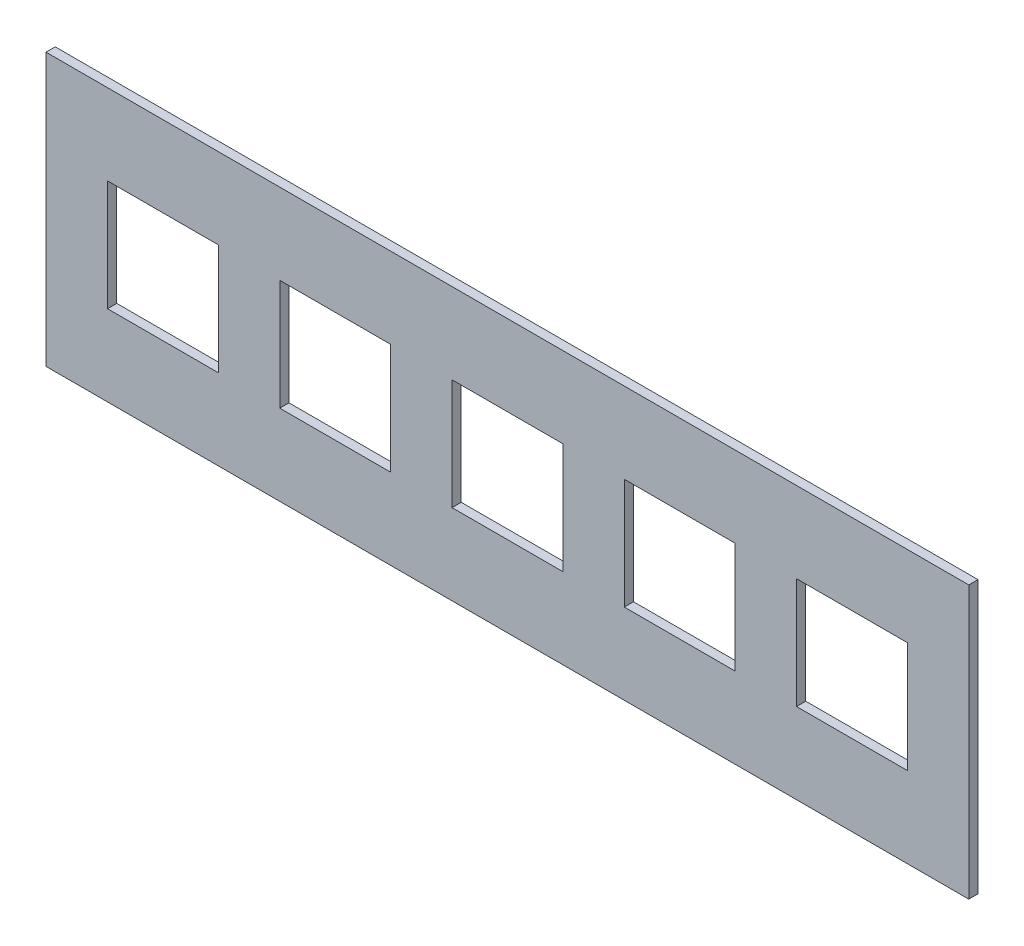
ISO-10303-21;
HEADER;
FILE_DESCRIPTION(('STEP AP214'),'2;1');
FILE_NAME('part.step','',(''),(''),'','','');
FILE_SCHEMA(('AUTOMOTIVE_DESIGN { 1 0 10303 214 1 1 1 1 }'));
ENDSEC;
DATA;
#1=APPLICATION_CONTEXT('core data for automotive mechanical design processes');
#2=APPLICATION_PROTOCOL_DEFINITION('international standard','automotive_design',2000,#1);
#3=PRODUCT_CONTEXT('',#1,'mechanical');
#4=PRODUCT('Part','Part','',(#3));
#5=PRODUCT_RELATED_PRODUCT_CATEGORY('part','',(#4));
#6=PRODUCT_DEFINITION_FORMATION('','',#4);
#7=PRODUCT_DEFINITION_CONTEXT('part definition',#1,'design');
#8=PRODUCT_DEFINITION('design','',#6,#7);
#9=PRODUCT_DEFINITION_SHAPE('','',#8);
#10=(LENGTH_UNIT() NAMED_UNIT(*) SI_UNIT(.MILLI.,.METRE.));
#11=(NAMED_UNIT(*) PLANE_ANGLE_UNIT() SI_UNIT($,.RADIAN.));
#12=(NAMED_UNIT(*) SI_UNIT($,.STERADIAN.) SOLID_ANGLE_UNIT());
#13=UNCERTAINTY_MEASURE_WITH_UNIT(LENGTH_MEASURE(1.E-05),#10,'distance_accuracy_value','');
#14=(GEOMETRIC_REPRESENTATION_CONTEXT(3) GLOBAL_UNCERTAINTY_ASSIGNED_CONTEXT((#13)) GLOBAL_UNIT_ASSIGNED_CONTEXT((#10,
#11,#12)) REPRESENTATION_CONTEXT('',''));
#15=CARTESIAN_POINT('',(0.,0.,0.));
#16=DIRECTION('',(0.,0.,1.));
#17=DIRECTION('',(1.,0.,0.));
#18=AXIS2_PLACEMENT_3D('',#15,#16,#17);
#19=CARTESIAN_POINT('',(0.,0.,3.));
#20=DIRECTION('',(0.,0.,-1.));
#21=DIRECTION('',(-1.,0.,0.));
#22=AXIS2_PLACEMENT_3D('',#19,#20,#21);
#23=PLANE('',#22);
#24=DIRECTION('',(-1.,0.,0.));
#25=VECTOR('',#24,1.);
#26=CARTESIAN_POINT('',(38.,18.,3.));
#27=LINE('',#26,#25);
#28=CARTESIAN_POINT('',(74.,18.,3.));
#29=VERTEX_POINT('',#28);
#30=CARTESIAN_POINT('',(38.,18.,3.));
#31=VERTEX_POINT('',#30);
#32=EDGE_CURVE('E234',#29,#31,#27,.T.);
#33=ORIENTED_EDGE('',*,*,#32,.F.);
#34=DIRECTION('',(0.,1.,0.));
#35=VECTOR('',#34,1.);
#36=CARTESIAN_POINT('',(74.,18.,3.));
#37=LINE('',#36,#35);
#38=CARTESIAN_POINT('',(74.,-18.,3.));
#39=VERTEX_POINT('',#38);
#40=EDGE_CURVE('E242',#39,#29,#37,.T.);
#41=ORIENTED_EDGE('',*,*,#40,.F.);
#42=DIRECTION('',(1.,0.,0.));
#43=VECTOR('',#42,1.);
#44=CARTESIAN_POINT('',(38.,-18.,3.));
#45=LINE('',#44,#43);
#46=CARTESIAN_POINT('',(38.,-18.,3.));
#47=VERTEX_POINT('',#46);
#48=EDGE_CURVE('E239',#47,#39,#45,.T.);
#49=ORIENTED_EDGE('',*,*,#48,.F.);
#50=DIRECTION('',(0.,-1.,0.));
#51=VECTOR('',#50,1.);
#52=CARTESIAN_POINT('',(38.,18.,3.));
#53=LINE('',#52,#51);
#54=EDGE_CURVE('E236',#31,#47,#53,.T.);
#55=ORIENTED_EDGE('',*,*,#54,.F.);
#56=EDGE_LOOP('',(#33,#41,#49,#55));
#57=FACE_BOUND('',#56,.T.);
#58=DIRECTION('',(-1.,0.,0.));
#59=VECTOR('',#58,1.);
#60=CARTESIAN_POINT('',(-74.,18.,3.));
#61=LINE('',#60,#59);
#62=CARTESIAN_POINT('',(-38.,18.,3.));
#63=VERTEX_POINT('',#62);
#64=CARTESIAN_POINT('',(-74.,18.,3.));
#65=VERTEX_POINT('',#64);
#66=EDGE_CURVE('E296',#63,#65,#61,.T.);
#67=ORIENTED_EDGE('',*,*,#66,.F.);
#68=DIRECTION('',(0.,1.,0.));
#69=VECTOR('',#68,1.);
#70=CARTESIAN_POINT('',(-38.,18.,3.));
#71=LINE('',#70,#69);
#72=CARTESIAN_POINT('',(-38.,-18.,3.));
#73=VERTEX_POINT('',#72);
#74=EDGE_CURVE('E304',#73,#63,#71,.T.);
#75=ORIENTED_EDGE('',*,*,#74,.F.);
#76=DIRECTION('',(1.,0.,0.));
#77=VECTOR('',#76,1.);
#78=CARTESIAN_POINT('',(-74.,-18.,3.));
#79=LINE('',#78,#77);
#80=CARTESIAN_POINT('',(-74.,-18.,3.));
#81=VERTEX_POINT('',#80);
#82=EDGE_CURVE('E301',#81,#73,#79,.T.);
#83=ORIENTED_EDGE('',*,*,#82,.F.);
#84=DIRECTION('',(0.,-1.,0.));
#85=VECTOR('',#84,1.);
#86=CARTESIAN_POINT('',(-74.,18.,3.));
#87=LINE('',#86,#85);
#88=EDGE_CURVE('E298',#65,#81,#87,.T.);
#89=ORIENTED_EDGE('',*,*,#88,.F.);
#90=EDGE_LOOP('',(#67,#75,#83,#89));
#91=FACE_BOUND('',#90,.T.);
#92=DIRECTION('',(0.,1.,0.));
#93=VECTOR('',#92,1.);
#94=CARTESIAN_POINT('',(150.,-44.24,3.));
#95=LINE('',#94,#93);
#96=CARTESIAN_POINT('',(150.,-44.24,3.));
#97=VERTEX_POINT('',#96);
#98=CARTESIAN_POINT('',(150.,44.24,3.));
#99=VERTEX_POINT('',#98);
#100=EDGE_CURVE('E358',#97,#99,#95,.T.);
#101=ORIENTED_EDGE('',*,*,#100,.T.);
#102=DIRECTION('',(-1.,0.,0.));
#103=VECTOR('',#102,1.);
#104=CARTESIAN_POINT('',(-150.,44.24,3.));
#105=LINE('',#104,#103);
#106=CARTESIAN_POINT('',(-150.,44.24,3.));
#107=VERTEX_POINT('',#106);
#108=EDGE_CURVE('E361',#99,#107,#105,.T.);
#109=ORIENTED_EDGE('',*,*,#108,.T.);
#110=DIRECTION('',(0.,-1.,0.));
#111=VECTOR('',#110,1.);
#112=CARTESIAN_POINT('',(-150.,-44.24,3.));
#113=LINE('',#112,#111);
#114=CARTESIAN_POINT('',(-150.,-44.24,3.));
#115=VERTEX_POINT('',#114);
#116=EDGE_CURVE('E364',#107,#115,#113,.T.);
#117=ORIENTED_EDGE('',*,*,#116,.T.);
#118=DIRECTION('',(1.,0.,0.));
#119=VECTOR('',#118,1.);
#120=CARTESIAN_POINT('',(-150.,-44.24,3.));
#121=LINE('',#120,#119);
#122=EDGE_CURVE('E366',#115,#97,#121,.T.);
#123=ORIENTED_EDGE('',*,*,#122,.T.);
#124=EDGE_LOOP('',(#101,#109,#117,#123));
#125=FACE_BOUND('',#124,.T.);
#126=DIRECTION('',(0.,-1.,0.));
#127=VECTOR('',#126,1.);
#128=CARTESIAN_POINT('',(-130.,18.,3.));
#129=LINE('',#128,#127);
#130=CARTESIAN_POINT('',(-130.,18.,3.));
#131=VERTEX_POINT('',#130);
#132=CARTESIAN_POINT('',(-130.,-18.,3.));
#133=VERTEX_POINT('',#132);
#134=EDGE_CURVE('E327',#131,#133,#129,.T.);
#135=ORIENTED_EDGE('',*,*,#134,.F.);
#136=DIRECTION('',(-1.,0.,0.));
#137=VECTOR('',#136,1.);
#138=CARTESIAN_POINT('',(-130.,18.,3.));
#139=LINE('',#138,#137);
#140=CARTESIAN_POINT('',(-94.,18.,3.));
#141=VERTEX_POINT('',#140);
#142=EDGE_CURVE('E335',#141,#131,#139,.T.);
#143=ORIENTED_EDGE('',*,*,#142,.F.);
#144=DIRECTION('',(0.,1.,0.));
#145=VECTOR('',#144,1.);
#146=CARTESIAN_POINT('',(-94.,18.,3.));
#147=LINE('',#146,#145);
#148=CARTESIAN_POINT('',(-94.,-18.,3.));
#149=VERTEX_POINT('',#148);
#150=EDGE_CURVE('E332',#149,#141,#147,.T.);
#151=ORIENTED_EDGE('',*,*,#150,.F.);
#152=DIRECTION('',(1.,0.,0.));
#153=VECTOR('',#152,1.);
#154=CARTESIAN_POINT('',(-130.,-18.,3.));
#155=LINE('',#154,#153);
#156=EDGE_CURVE('E329',#133,#149,#155,.T.);
#157=ORIENTED_EDGE('',*,*,#156,.F.);
#158=EDGE_LOOP('',(#135,#143,#151,#157));
#159=FACE_BOUND('',#158,.T.);
#160=DIRECTION('',(-1.,0.,0.));
#161=VECTOR('',#160,1.);
#162=CARTESIAN_POINT('',(-18.,18.,3.));
#163=LINE('',#162,#161);
#164=CARTESIAN_POINT('',(18.,18.,3.));
#165=VERTEX_POINT('',#164);
#166=CARTESIAN_POINT('',(-18.,18.,3.));
#167=VERTEX_POINT('',#166);
#168=EDGE_CURVE('E265',#165,#167,#163,.T.);
#169=ORIENTED_EDGE('',*,*,#168,.F.);
#170=DIRECTION('',(0.,1.,0.));
#171=VECTOR('',#170,1.);
#172=CARTESIAN_POINT('',(18.,18.,3.));
#173=LINE('',#172,#171);
#174=CARTESIAN_POINT('',(18.,-18.,3.));
#175=VERTEX_POINT('',#174);
#176=EDGE_CURVE('E273',#175,#165,#173,.T.);
#177=ORIENTED_EDGE('',*,*,#176,.F.);
#178=DIRECTION('',(1.,0.,0.));
#179=VECTOR('',#178,1.);
#180=CARTESIAN_POINT('',(-18.,-18.,3.));
#181=LINE('',#180,#179);
#182=CARTESIAN_POINT('',(-18.,-18.,3.));
#183=VERTEX_POINT('',#182);
#184=EDGE_CURVE('E270',#183,#175,#181,.T.);
#185=ORIENTED_EDGE('',*,*,#184,.F.);
#186=DIRECTION('',(0.,-1.,0.));
#187=VECTOR('',#186,1.);
#188=CARTESIAN_POINT('',(-18.,18.,3.));
#189=LINE('',#188,#187);
#190=EDGE_CURVE('E267',#167,#183,#189,.T.);
#191=ORIENTED_EDGE('',*,*,#190,.F.);
#192=EDGE_LOOP('',(#169,#177,#185,#191));
#193=FACE_BOUND('',#192,.T.);
#194=DIRECTION('',(-1.,0.,0.));
#195=VECTOR('',#194,1.);
#196=CARTESIAN_POINT('',(94.,18.,3.));
#197=LINE('',#196,#195);
#198=CARTESIAN_POINT('',(130.,18.,3.));
#199=VERTEX_POINT('',#198);
#200=CARTESIAN_POINT('',(94.,18.,3.));
#201=VERTEX_POINT('',#200);
#202=EDGE_CURVE('E198',#199,#201,#197,.T.);
#203=ORIENTED_EDGE('',*,*,#202,.F.);
#204=DIRECTION('',(0.,1.,0.));
#205=VECTOR('',#204,1.);
#206=CARTESIAN_POINT('',(130.,18.,3.));
#207=LINE('',#206,#205);
#208=CARTESIAN_POINT('',(130.,-18.,3.));
#209=VERTEX_POINT('',#208);
#210=EDGE_CURVE('E220',#209,#199,#207,.T.);
#211=ORIENTED_EDGE('',*,*,#210,.F.);
#212=DIRECTION('',(1.,0.,0.));
#213=VECTOR('',#212,1.);
#214=CARTESIAN_POINT('',(94.,-18.,3.));
#215=LINE('',#214,#213);
#216=CARTESIAN_POINT('',(94.,-18.,3.));
#217=VERTEX_POINT('',#216);
#218=EDGE_CURVE('E218',#217,#209,#215,.T.);
#219=ORIENTED_EDGE('',*,*,#218,.F.);
#220=DIRECTION('',(0.,-1.,0.));
#221=VECTOR('',#220,1.);
#222=CARTESIAN_POINT('',(94.,18.,3.));
#223=LINE('',#222,#221);
#224=EDGE_CURVE('E206',#201,#217,#223,.T.);
#225=ORIENTED_EDGE('',*,*,#224,.F.);
#226=EDGE_LOOP('',(#203,#211,#219,#225));
#227=FACE_BOUND('',#226,.T.);
#228=ADVANCED_FACE('F37',(#57,#91,#125,#159,#193,#227),#23,.F.);
#229=CARTESIAN_POINT('',(0.,0.,0.));
#230=DIRECTION('',(0.,0.,-1.));
#231=DIRECTION('',(-1.,0.,0.));
#232=AXIS2_PLACEMENT_3D('',#229,#230,#231);
#233=PLANE('',#232);
#234=DIRECTION('',(0.,1.,0.));
#235=VECTOR('',#234,1.);
#236=CARTESIAN_POINT('',(150.,-44.24,0.));
#237=LINE('',#236,#235);
#238=CARTESIAN_POINT('',(150.,-44.24,0.));
#239=VERTEX_POINT('',#238);
#240=CARTESIAN_POINT('',(150.,44.24,0.));
#241=VERTEX_POINT('',#240);
#242=EDGE_CURVE('E357',#239,#241,#237,.T.);
#243=ORIENTED_EDGE('',*,*,#242,.F.);
#244=DIRECTION('',(1.,0.,0.));
#245=VECTOR('',#244,1.);
#246=CARTESIAN_POINT('',(-150.,-44.24,0.));
#247=LINE('',#246,#245);
#248=CARTESIAN_POINT('',(-150.,-44.24,0.));
#249=VERTEX_POINT('',#248);
#250=EDGE_CURVE('E362',#249,#239,#247,.T.);
#251=ORIENTED_EDGE('',*,*,#250,.F.);
#252=DIRECTION('',(0.,-1.,0.));
#253=VECTOR('',#252,1.);
#254=CARTESIAN_POINT('',(-150.,-44.24,0.));
#255=LINE('',#254,#253);
#256=CARTESIAN_POINT('',(-150.,44.24,0.));
#257=VERTEX_POINT('',#256);
#258=EDGE_CURVE('E373',#257,#249,#255,.T.);
#259=ORIENTED_EDGE('',*,*,#258,.F.);
#260=DIRECTION('',(-1.,0.,0.));
#261=VECTOR('',#260,1.);
#262=CARTESIAN_POINT('',(-150.,44.24,0.));
#263=LINE('',#262,#261);
#264=EDGE_CURVE('E371',#241,#257,#263,.T.);
#265=ORIENTED_EDGE('',*,*,#264,.F.);
#266=EDGE_LOOP('',(#243,#251,#259,#265));
#267=FACE_BOUND('',#266,.T.);
#268=DIRECTION('',(-1.,0.,0.));
#269=VECTOR('',#268,1.);
#270=CARTESIAN_POINT('',(-130.,18.,0.));
#271=LINE('',#270,#269);
#272=CARTESIAN_POINT('',(-94.,18.,0.));
#273=VERTEX_POINT('',#272);
#274=CARTESIAN_POINT('',(-130.,18.,0.));
#275=VERTEX_POINT('',#274);
#276=EDGE_CURVE('E330',#273,#275,#271,.T.);
#277=ORIENTED_EDGE('',*,*,#276,.T.);
#278=DIRECTION('',(0.,-1.,0.));
#279=VECTOR('',#278,1.);
#280=CARTESIAN_POINT('',(-130.,18.,0.));
#281=LINE('',#280,#279);
#282=CARTESIAN_POINT('',(-130.,-18.,0.));
#283=VERTEX_POINT('',#282);
#284=EDGE_CURVE('E326',#275,#283,#281,.T.);
#285=ORIENTED_EDGE('',*,*,#284,.T.);
#286=DIRECTION('',(1.,0.,0.));
#287=VECTOR('',#286,1.);
#288=CARTESIAN_POINT('',(-130.,-18.,0.));
#289=LINE('',#288,#287);
#290=CARTESIAN_POINT('',(-94.,-18.,0.));
#291=VERTEX_POINT('',#290);
#292=EDGE_CURVE('E340',#283,#291,#289,.T.);
#293=ORIENTED_EDGE('',*,*,#292,.T.);
#294=DIRECTION('',(0.,1.,0.));
#295=VECTOR('',#294,1.);
#296=CARTESIAN_POINT('',(-94.,18.,0.));
#297=LINE('',#296,#295);
#298=EDGE_CURVE('E343',#291,#273,#297,.T.);
#299=ORIENTED_EDGE('',*,*,#298,.T.);
#300=EDGE_LOOP('',(#277,#285,#293,#299));
#301=FACE_BOUND('',#300,.T.);
#302=DIRECTION('',(0.,1.,0.));
#303=VECTOR('',#302,1.);
#304=CARTESIAN_POINT('',(-38.,18.,0.));
#305=LINE('',#304,#303);
#306=CARTESIAN_POINT('',(-38.,-18.,0.));
#307=VERTEX_POINT('',#306);
#308=CARTESIAN_POINT('',(-38.,18.,0.));
#309=VERTEX_POINT('',#308);
#310=EDGE_CURVE('E299',#307,#309,#305,.T.);
#311=ORIENTED_EDGE('',*,*,#310,.T.);
#312=DIRECTION('',(-1.,0.,0.));
#313=VECTOR('',#312,1.);
#314=CARTESIAN_POINT('',(-74.,18.,0.));
#315=LINE('',#314,#313);
#316=CARTESIAN_POINT('',(-74.,18.,0.));
#317=VERTEX_POINT('',#316);
#318=EDGE_CURVE('E295',#309,#317,#315,.T.);
#319=ORIENTED_EDGE('',*,*,#318,.T.);
#320=DIRECTION('',(0.,-1.,0.));
#321=VECTOR('',#320,1.);
#322=CARTESIAN_POINT('',(-74.,18.,0.));
#323=LINE('',#322,#321);
#324=CARTESIAN_POINT('',(-74.,-18.,0.));
#325=VERTEX_POINT('',#324);
#326=EDGE_CURVE('E309',#317,#325,#323,.T.);
#327=ORIENTED_EDGE('',*,*,#326,.T.);
#328=DIRECTION('',(1.,0.,0.));
#329=VECTOR('',#328,1.);
#330=CARTESIAN_POINT('',(-74.,-18.,0.));
#331=LINE('',#330,#329);
#332=EDGE_CURVE('E312',#325,#307,#331,.T.);
#333=ORIENTED_EDGE('',*,*,#332,.T.);
#334=EDGE_LOOP('',(#311,#319,#327,#333));
#335=FACE_BOUND('',#334,.T.);
#336=DIRECTION('',(0.,1.,0.));
#337=VECTOR('',#336,1.);
#338=CARTESIAN_POINT('',(18.,18.,0.));
#339=LINE('',#338,#337);
#340=CARTESIAN_POINT('',(18.,-18.,0.));
#341=VERTEX_POINT('',#340);
#342=CARTESIAN_POINT('',(18.,18.,0.));
#343=VERTEX_POINT('',#342);
#344=EDGE_CURVE('E268',#341,#343,#339,.T.);
#345=ORIENTED_EDGE('',*,*,#344,.T.);
#346=DIRECTION('',(-1.,0.,0.));
#347=VECTOR('',#346,1.);
#348=CARTESIAN_POINT('',(-18.,18.,0.));
#349=LINE('',#348,#347);
#350=CARTESIAN_POINT('',(-18.,18.,0.));
#351=VERTEX_POINT('',#350);
#352=EDGE_CURVE('E264',#343,#351,#349,.T.);
#353=ORIENTED_EDGE('',*,*,#352,.T.);
#354=DIRECTION('',(0.,-1.,0.));
#355=VECTOR('',#354,1.);
#356=CARTESIAN_POINT('',(-18.,18.,0.));
#357=LINE('',#356,#355);
#358=CARTESIAN_POINT('',(-18.,-18.,0.));
#359=VERTEX_POINT('',#358);
#360=EDGE_CURVE('E278',#351,#359,#357,.T.);
#361=ORIENTED_EDGE('',*,*,#360,.T.);
#362=DIRECTION('',(1.,0.,0.));
#363=VECTOR('',#362,1.);
#364=CARTESIAN_POINT('',(-18.,-18.,0.));
#365=LINE('',#364,#363);
#366=EDGE_CURVE('E281',#359,#341,#365,.T.);
#367=ORIENTED_EDGE('',*,*,#366,.T.);
#368=EDGE_LOOP('',(#345,#353,#361,#367));
#369=FACE_BOUND('',#368,.T.);
#370=DIRECTION('',(0.,1.,0.));
#371=VECTOR('',#370,1.);
#372=CARTESIAN_POINT('',(74.,18.,0.));
#373=LINE('',#372,#371);
#374=CARTESIAN_POINT('',(74.,-18.,0.));
#375=VERTEX_POINT('',#374);
#376=CARTESIAN_POINT('',(74.,18.,0.));
#377=VERTEX_POINT('',#376);
#378=EDGE_CURVE('E237',#375,#377,#373,.T.);
#379=ORIENTED_EDGE('',*,*,#378,.T.);
#380=DIRECTION('',(-1.,0.,0.));
#381=VECTOR('',#380,1.);
#382=CARTESIAN_POINT('',(38.,18.,0.));
#383=LINE('',#382,#381);
#384=CARTESIAN_POINT('',(38.,18.,0.));
#385=VERTEX_POINT('',#384);
#386=EDGE_CURVE('E214',#377,#385,#383,.T.);
#387=ORIENTED_EDGE('',*,*,#386,.T.);
#388=DIRECTION('',(0.,-1.,0.));
#389=VECTOR('',#388,1.);
#390=CARTESIAN_POINT('',(38.,18.,0.));
#391=LINE('',#390,#389);
#392=CARTESIAN_POINT('',(38.,-18.,0.));
#393=VERTEX_POINT('',#392);
#394=EDGE_CURVE('E247',#385,#393,#391,.T.);
#395=ORIENTED_EDGE('',*,*,#394,.T.);
#396=DIRECTION('',(1.,0.,0.));
#397=VECTOR('',#396,1.);
#398=CARTESIAN_POINT('',(38.,-18.,0.));
#399=LINE('',#398,#397);
#400=EDGE_CURVE('E250',#393,#375,#399,.T.);
#401=ORIENTED_EDGE('',*,*,#400,.T.);
#402=EDGE_LOOP('',(#379,#387,#395,#401));
#403=FACE_BOUND('',#402,.T.);
#404=DIRECTION('',(0.,1.,0.));
#405=VECTOR('',#404,1.);
#406=CARTESIAN_POINT('',(130.,18.,0.));
#407=LINE('',#406,#405);
#408=CARTESIAN_POINT('',(130.,-18.,0.));
#409=VERTEX_POINT('',#408);
#410=CARTESIAN_POINT('',(130.,18.,0.));
#411=VERTEX_POINT('',#410);
#412=EDGE_CURVE('E207',#409,#411,#407,.T.);
#413=ORIENTED_EDGE('',*,*,#412,.T.);
#414=DIRECTION('',(-1.,0.,0.));
#415=VECTOR('',#414,1.);
#416=CARTESIAN_POINT('',(94.,18.,0.));
#417=LINE('',#416,#415);
#418=CARTESIAN_POINT('',(94.,18.,0.));
#419=VERTEX_POINT('',#418);
#420=EDGE_CURVE('E60',#411,#419,#417,.T.);
#421=ORIENTED_EDGE('',*,*,#420,.T.);
#422=DIRECTION('',(0.,-1.,0.));
#423=VECTOR('',#422,1.);
#424=CARTESIAN_POINT('',(94.,18.,0.));
#425=LINE('',#424,#423);
#426=CARTESIAN_POINT('',(94.,-18.,0.));
#427=VERTEX_POINT('',#426);
#428=EDGE_CURVE('E213',#419,#427,#425,.T.);
#429=ORIENTED_EDGE('',*,*,#428,.T.);
#430=DIRECTION('',(1.,0.,0.));
#431=VECTOR('',#430,1.);
#432=CARTESIAN_POINT('',(94.,-18.,0.));
#433=LINE('',#432,#431);
#434=EDGE_CURVE('E226',#427,#409,#433,.T.);
#435=ORIENTED_EDGE('',*,*,#434,.T.);
#436=EDGE_LOOP('',(#413,#421,#429,#435));
#437=FACE_BOUND('',#436,.T.);
#438=ADVANCED_FACE('F391',(#267,#301,#335,#369,#403,#437),#233,.T.);
#439=CARTESIAN_POINT('',(150.,-44.24,3.));
#440=DIRECTION('',(-1.,0.,0.));
#441=DIRECTION('',(0.,0.,1.));
#442=AXIS2_PLACEMENT_3D('',#439,#440,#441);
#443=PLANE('',#442);
#444=ORIENTED_EDGE('',*,*,#242,.T.);
#445=DIRECTION('',(0.,0.,-1.));
#446=VECTOR('',#445,1.);
#447=CARTESIAN_POINT('',(150.,44.24,3.));
#448=LINE('',#447,#446);
#449=EDGE_CURVE('E11',#99,#241,#448,.T.);
#450=ORIENTED_EDGE('',*,*,#449,.F.);
#451=ORIENTED_EDGE('',*,*,#100,.F.);
#452=DIRECTION('',(0.,0.,-1.));
#453=VECTOR('',#452,1.);
#454=CARTESIAN_POINT('',(150.,-44.24,3.));
#455=LINE('',#454,#453);
#456=EDGE_CURVE('E368',#97,#239,#455,.T.);
#457=ORIENTED_EDGE('',*,*,#456,.T.);
#458=EDGE_LOOP('',(#444,#450,#451,#457));
#459=FACE_BOUND('',#458,.T.);
#460=ADVANCED_FACE('F39',(#459),#443,.F.);
#461=CARTESIAN_POINT('',(-150.,44.24,3.));
#462=DIRECTION('',(0.,-1.,0.));
#463=DIRECTION('',(0.,0.,-1.));
#464=AXIS2_PLACEMENT_3D('',#461,#462,#463);
#465=PLANE('',#464);
#466=ORIENTED_EDGE('',*,*,#264,.T.);
#467=DIRECTION('',(0.,0.,-1.));
#468=VECTOR('',#467,1.);
#469=CARTESIAN_POINT('',(-150.,44.24,3.));
#470=LINE('',#469,#468);
#471=EDGE_CURVE('E45',#107,#257,#470,.T.);
#472=ORIENTED_EDGE('',*,*,#471,.F.);
#473=ORIENTED_EDGE('',*,*,#108,.F.);
#474=ORIENTED_EDGE('',*,*,#449,.T.);
#475=EDGE_LOOP('',(#466,#472,#473,#474));
#476=FACE_BOUND('',#475,.T.);
#477=ADVANCED_FACE('F402',(#476),#465,.F.);
#478=CARTESIAN_POINT('',(-150.,-44.24,3.));
#479=DIRECTION('',(1.,0.,0.));
#480=DIRECTION('',(0.,0.,-1.));
#481=AXIS2_PLACEMENT_3D('',#478,#479,#480);
#482=PLANE('',#481);
#483=ORIENTED_EDGE('',*,*,#258,.T.);
#484=DIRECTION('',(0.,0.,-1.));
#485=VECTOR('',#484,1.);
#486=CARTESIAN_POINT('',(-150.,-44.24,3.));
#487=LINE('',#486,#485);
#488=EDGE_CURVE('E378',#115,#249,#487,.T.);
#489=ORIENTED_EDGE('',*,*,#488,.F.);
#490=ORIENTED_EDGE('',*,*,#116,.F.);
#491=ORIENTED_EDGE('',*,*,#471,.T.);
#492=EDGE_LOOP('',(#483,#489,#490,#491));
#493=FACE_BOUND('',#492,.T.);
#494=ADVANCED_FACE('F385',(#493),#482,.F.);
#495=CARTESIAN_POINT('',(-150.,-44.24,3.));
#496=DIRECTION('',(0.,1.,0.));
#497=DIRECTION('',(0.,0.,1.));
#498=AXIS2_PLACEMENT_3D('',#495,#496,#497);
#499=PLANE('',#498);
#500=ORIENTED_EDGE('',*,*,#250,.T.);
#501=ORIENTED_EDGE('',*,*,#456,.F.);
#502=ORIENTED_EDGE('',*,*,#122,.F.);
#503=ORIENTED_EDGE('',*,*,#488,.T.);
#504=EDGE_LOOP('',(#500,#501,#502,#503));
#505=FACE_BOUND('',#504,.T.);
#506=ADVANCED_FACE('F395',(#505),#499,.F.);
#507=CARTESIAN_POINT('',(-130.,18.,3.));
#508=DIRECTION('',(1.,0.,0.));
#509=DIRECTION('',(0.,0.,-1.));
#510=AXIS2_PLACEMENT_3D('',#507,#508,#509);
#511=PLANE('',#510);
#512=ORIENTED_EDGE('',*,*,#284,.F.);
#513=DIRECTION('',(0.,0.,-1.));
#514=VECTOR('',#513,1.);
#515=CARTESIAN_POINT('',(-130.,18.,3.));
#516=LINE('',#515,#514);
#517=EDGE_CURVE('E337',#131,#275,#516,.T.);
#518=ORIENTED_EDGE('',*,*,#517,.F.);
#519=ORIENTED_EDGE('',*,*,#134,.T.);
#520=DIRECTION('',(0.,0.,-1.));
#521=VECTOR('',#520,1.);
#522=CARTESIAN_POINT('',(-130.,-18.,3.));
#523=LINE('',#522,#521);
#524=EDGE_CURVE('E354',#133,#283,#523,.T.);
#525=ORIENTED_EDGE('',*,*,#524,.T.);
#526=EDGE_LOOP('',(#512,#518,#519,#525));
#527=FACE_BOUND('',#526,.T.);
#528=ADVANCED_FACE('F419',(#527),#511,.T.);
#529=CARTESIAN_POINT('',(-130.,-18.,3.));
#530=DIRECTION('',(0.,1.,0.));
#531=DIRECTION('',(0.,0.,1.));
#532=AXIS2_PLACEMENT_3D('',#529,#530,#531);
#533=PLANE('',#532);
#534=ORIENTED_EDGE('',*,*,#292,.F.);
#535=ORIENTED_EDGE('',*,*,#524,.F.);
#536=ORIENTED_EDGE('',*,*,#156,.T.);
#537=DIRECTION('',(0.,0.,-1.));
#538=VECTOR('',#537,1.);
#539=CARTESIAN_POINT('',(-94.,-18.,3.));
#540=LINE('',#539,#538);
#541=EDGE_CURVE('E352',#149,#291,#540,.T.);
#542=ORIENTED_EDGE('',*,*,#541,.T.);
#543=EDGE_LOOP('',(#534,#535,#536,#542));
#544=FACE_BOUND('',#543,.T.);
#545=ADVANCED_FACE('F426',(#544),#533,.T.);
#546=CARTESIAN_POINT('',(-94.,18.,3.));
#547=DIRECTION('',(-1.,0.,0.));
#548=DIRECTION('',(0.,0.,1.));
#549=AXIS2_PLACEMENT_3D('',#546,#547,#548);
#550=PLANE('',#549);
#551=ORIENTED_EDGE('',*,*,#298,.F.);
#552=ORIENTED_EDGE('',*,*,#541,.F.);
#553=ORIENTED_EDGE('',*,*,#150,.T.);
#554=DIRECTION('',(0.,0.,-1.));
#555=VECTOR('',#554,1.);
#556=CARTESIAN_POINT('',(-94.,18.,3.));
#557=LINE('',#556,#555);
#558=EDGE_CURVE('E350',#141,#273,#557,.T.);
#559=ORIENTED_EDGE('',*,*,#558,.T.);
#560=EDGE_LOOP('',(#551,#552,#553,#559));
#561=FACE_BOUND('',#560,.T.);
#562=ADVANCED_FACE('F431',(#561),#550,.T.);
#563=CARTESIAN_POINT('',(-130.,18.,3.));
#564=DIRECTION('',(0.,-1.,0.));
#565=DIRECTION('',(0.,0.,-1.));
#566=AXIS2_PLACEMENT_3D('',#563,#564,#565);
#567=PLANE('',#566);
#568=ORIENTED_EDGE('',*,*,#276,.F.);
#569=ORIENTED_EDGE('',*,*,#558,.F.);
#570=ORIENTED_EDGE('',*,*,#142,.T.);
#571=ORIENTED_EDGE('',*,*,#517,.T.);
#572=EDGE_LOOP('',(#568,#569,#570,#571));
#573=FACE_BOUND('',#572,.T.);
#574=ADVANCED_FACE('F438',(#573),#567,.T.);
#575=CARTESIAN_POINT('',(-74.,18.,3.));
#576=DIRECTION('',(0.,-1.,0.));
#577=DIRECTION('',(0.,0.,-1.));
#578=AXIS2_PLACEMENT_3D('',#575,#576,#577);
#579=PLANE('',#578);
#580=ORIENTED_EDGE('',*,*,#318,.F.);
#581=DIRECTION('',(0.,0.,-1.));
#582=VECTOR('',#581,1.);
#583=CARTESIAN_POINT('',(-38.,18.,3.));
#584=LINE('',#583,#582);
#585=EDGE_CURVE('E306',#63,#309,#584,.T.);
#586=ORIENTED_EDGE('',*,*,#585,.F.);
#587=ORIENTED_EDGE('',*,*,#66,.T.);
#588=DIRECTION('',(0.,0.,-1.));
#589=VECTOR('',#588,1.);
#590=CARTESIAN_POINT('',(-74.,18.,3.));
#591=LINE('',#590,#589);
#592=EDGE_CURVE('E323',#65,#317,#591,.T.);
#593=ORIENTED_EDGE('',*,*,#592,.T.);
#594=EDGE_LOOP('',(#580,#586,#587,#593));
#595=FACE_BOUND('',#594,.T.);
#596=ADVANCED_FACE('F490',(#595),#579,.T.);
#597=CARTESIAN_POINT('',(-74.,18.,3.));
#598=DIRECTION('',(1.,0.,0.));
#599=DIRECTION('',(0.,0.,-1.));
#600=AXIS2_PLACEMENT_3D('',#597,#598,#599);
#601=PLANE('',#600);
#602=ORIENTED_EDGE('',*,*,#326,.F.);
#603=ORIENTED_EDGE('',*,*,#592,.F.);
#604=ORIENTED_EDGE('',*,*,#88,.T.);
#605=DIRECTION('',(0.,0.,-1.));
#606=VECTOR('',#605,1.);
#607=CARTESIAN_POINT('',(-74.,-18.,3.));
#608=LINE('',#607,#606);
#609=EDGE_CURVE('E321',#81,#325,#608,.T.);
#610=ORIENTED_EDGE('',*,*,#609,.T.);
#611=EDGE_LOOP('',(#602,#603,#604,#610));
#612=FACE_BOUND('',#611,.T.);
#613=ADVANCED_FACE('F486',(#612),#601,.T.);
#614=CARTESIAN_POINT('',(-74.,-18.,3.));
#615=DIRECTION('',(0.,1.,0.));
#616=DIRECTION('',(0.,0.,1.));
#617=AXIS2_PLACEMENT_3D('',#614,#615,#616);
#618=PLANE('',#617);
#619=ORIENTED_EDGE('',*,*,#332,.F.);
#620=ORIENTED_EDGE('',*,*,#609,.F.);
#621=ORIENTED_EDGE('',*,*,#82,.T.);
#622=DIRECTION('',(0.,0.,-1.));
#623=VECTOR('',#622,1.);
#624=CARTESIAN_POINT('',(-38.,-18.,3.));
#625=LINE('',#624,#623);
#626=EDGE_CURVE('E319',#73,#307,#625,.T.);
#627=ORIENTED_EDGE('',*,*,#626,.T.);
#628=EDGE_LOOP('',(#619,#620,#621,#627));
#629=FACE_BOUND('',#628,.T.);
#630=ADVANCED_FACE('F482',(#629),#618,.T.);
#631=CARTESIAN_POINT('',(-38.,18.,3.));
#632=DIRECTION('',(-1.,0.,0.));
#633=DIRECTION('',(0.,0.,1.));
#634=AXIS2_PLACEMENT_3D('',#631,#632,#633);
#635=PLANE('',#634);
#636=ORIENTED_EDGE('',*,*,#310,.F.);
#637=ORIENTED_EDGE('',*,*,#626,.F.);
#638=ORIENTED_EDGE('',*,*,#74,.T.);
#639=ORIENTED_EDGE('',*,*,#585,.T.);
#640=EDGE_LOOP('',(#636,#637,#638,#639));
#641=FACE_BOUND('',#640,.T.);
#642=ADVANCED_FACE('F479',(#641),#635,.T.);
#643=CARTESIAN_POINT('',(-18.,18.,3.));
#644=DIRECTION('',(0.,-1.,0.));
#645=DIRECTION('',(0.,0.,-1.));
#646=AXIS2_PLACEMENT_3D('',#643,#644,#645);
#647=PLANE('',#646);
#648=ORIENTED_EDGE('',*,*,#352,.F.);
#649=DIRECTION('',(0.,0.,-1.));
#650=VECTOR('',#649,1.);
#651=CARTESIAN_POINT('',(18.,18.,3.));
#652=LINE('',#651,#650);
#653=EDGE_CURVE('E275',#165,#343,#652,.T.);
#654=ORIENTED_EDGE('',*,*,#653,.F.);
#655=ORIENTED_EDGE('',*,*,#168,.T.);
#656=DIRECTION('',(0.,0.,-1.));
#657=VECTOR('',#656,1.);
#658=CARTESIAN_POINT('',(-18.,18.,3.));
#659=LINE('',#658,#657);
#660=EDGE_CURVE('E292',#167,#351,#659,.T.);
#661=ORIENTED_EDGE('',*,*,#660,.T.);
#662=EDGE_LOOP('',(#648,#654,#655,#661));
#663=FACE_BOUND('',#662,.T.);
#664=ADVANCED_FACE('F454',(#663),#647,.T.);
#665=CARTESIAN_POINT('',(-18.,18.,3.));
#666=DIRECTION('',(1.,0.,0.));
#667=DIRECTION('',(0.,0.,-1.));
#668=AXIS2_PLACEMENT_3D('',#665,#666,#667);
#669=PLANE('',#668);
#670=ORIENTED_EDGE('',*,*,#360,.F.);
#671=ORIENTED_EDGE('',*,*,#660,.F.);
#672=ORIENTED_EDGE('',*,*,#190,.T.);
#673=DIRECTION('',(0.,0.,-1.));
#674=VECTOR('',#673,1.);
#675=CARTESIAN_POINT('',(-18.,-18.,3.));
#676=LINE('',#675,#674);
#677=EDGE_CURVE('E290',#183,#359,#676,.T.);
#678=ORIENTED_EDGE('',*,*,#677,.T.);
#679=EDGE_LOOP('',(#670,#671,#672,#678));
#680=FACE_BOUND('',#679,.T.);
#681=ADVANCED_FACE('F456',(#680),#669,.T.);
#682=CARTESIAN_POINT('',(-18.,-18.,3.));
#683=DIRECTION('',(0.,1.,0.));
#684=DIRECTION('',(0.,0.,1.));
#685=AXIS2_PLACEMENT_3D('',#682,#683,#684);
#686=PLANE('',#685);
#687=ORIENTED_EDGE('',*,*,#366,.F.);
#688=ORIENTED_EDGE('',*,*,#677,.F.);
#689=ORIENTED_EDGE('',*,*,#184,.T.);
#690=DIRECTION('',(0.,0.,-1.));
#691=VECTOR('',#690,1.);
#692=CARTESIAN_POINT('',(18.,-18.,3.));
#693=LINE('',#692,#691);
#694=EDGE_CURVE('E288',#175,#341,#693,.T.);
#695=ORIENTED_EDGE('',*,*,#694,.T.);
#696=EDGE_LOOP('',(#687,#688,#689,#695));
#697=FACE_BOUND('',#696,.T.);
#698=ADVANCED_FACE('F465',(#697),#686,.T.);
#699=CARTESIAN_POINT('',(18.,18.,3.));
#700=DIRECTION('',(-1.,0.,0.));
#701=DIRECTION('',(0.,0.,1.));
#702=AXIS2_PLACEMENT_3D('',#699,#700,#701);
#703=PLANE('',#702);
#704=ORIENTED_EDGE('',*,*,#344,.F.);
#705=ORIENTED_EDGE('',*,*,#694,.F.);
#706=ORIENTED_EDGE('',*,*,#176,.T.);
#707=ORIENTED_EDGE('',*,*,#653,.T.);
#708=EDGE_LOOP('',(#704,#705,#706,#707));
#709=FACE_BOUND('',#708,.T.);
#710=ADVANCED_FACE('F463',(#709),#703,.T.);
#711=CARTESIAN_POINT('',(38.,18.,3.));
#712=DIRECTION('',(0.,-1.,0.));
#713=DIRECTION('',(0.,0.,-1.));
#714=AXIS2_PLACEMENT_3D('',#711,#712,#713);
#715=PLANE('',#714);
#716=ORIENTED_EDGE('',*,*,#386,.F.);
#717=DIRECTION('',(0.,0.,-1.));
#718=VECTOR('',#717,1.);
#719=CARTESIAN_POINT('',(74.,18.,3.));
#720=LINE('',#719,#718);
#721=EDGE_CURVE('E244',#29,#377,#720,.T.);
#722=ORIENTED_EDGE('',*,*,#721,.F.);
#723=ORIENTED_EDGE('',*,*,#32,.T.);
#724=DIRECTION('',(0.,0.,-1.));
#725=VECTOR('',#724,1.);
#726=CARTESIAN_POINT('',(38.,18.,3.));
#727=LINE('',#726,#725);
#728=EDGE_CURVE('E261',#31,#385,#727,.T.);
#729=ORIENTED_EDGE('',*,*,#728,.T.);
#730=EDGE_LOOP('',(#716,#722,#723,#729));
#731=FACE_BOUND('',#730,.T.);
#732=ADVANCED_FACE('F472',(#731),#715,.T.);
#733=CARTESIAN_POINT('',(38.,18.,3.));
#734=DIRECTION('',(1.,0.,0.));
#735=DIRECTION('',(0.,0.,-1.));
#736=AXIS2_PLACEMENT_3D('',#733,#734,#735);
#737=PLANE('',#736);
#738=ORIENTED_EDGE('',*,*,#394,.F.);
#739=ORIENTED_EDGE('',*,*,#728,.F.);
#740=ORIENTED_EDGE('',*,*,#54,.T.);
#741=DIRECTION('',(0.,0.,-1.));
#742=VECTOR('',#741,1.);
#743=CARTESIAN_POINT('',(38.,-18.,3.));
#744=LINE('',#743,#742);
#745=EDGE_CURVE('E259',#47,#393,#744,.T.);
#746=ORIENTED_EDGE('',*,*,#745,.T.);
#747=EDGE_LOOP('',(#738,#739,#740,#746));
#748=FACE_BOUND('',#747,.T.);
#749=ADVANCED_FACE('F549',(#748),#737,.T.);
#750=CARTESIAN_POINT('',(38.,-18.,3.));
#751=DIRECTION('',(0.,1.,0.));
#752=DIRECTION('',(0.,0.,1.));
#753=AXIS2_PLACEMENT_3D('',#750,#751,#752);
#754=PLANE('',#753);
#755=ORIENTED_EDGE('',*,*,#400,.F.);
#756=ORIENTED_EDGE('',*,*,#745,.F.);
#757=ORIENTED_EDGE('',*,*,#48,.T.);
#758=DIRECTION('',(0.,0.,-1.));
#759=VECTOR('',#758,1.);
#760=CARTESIAN_POINT('',(74.,-18.,3.));
#761=LINE('',#760,#759);
#762=EDGE_CURVE('E257',#39,#375,#761,.T.);
#763=ORIENTED_EDGE('',*,*,#762,.T.);
#764=EDGE_LOOP('',(#755,#756,#757,#763));
#765=FACE_BOUND('',#764,.T.);
#766=ADVANCED_FACE('F558',(#765),#754,.T.);
#767=CARTESIAN_POINT('',(74.,18.,3.));
#768=DIRECTION('',(-1.,0.,0.));
#769=DIRECTION('',(0.,0.,1.));
#770=AXIS2_PLACEMENT_3D('',#767,#768,#769);
#771=PLANE('',#770);
#772=ORIENTED_EDGE('',*,*,#378,.F.);
#773=ORIENTED_EDGE('',*,*,#762,.F.);
#774=ORIENTED_EDGE('',*,*,#40,.T.);
#775=ORIENTED_EDGE('',*,*,#721,.T.);
#776=EDGE_LOOP('',(#772,#773,#774,#775));
#777=FACE_BOUND('',#776,.T.);
#778=ADVANCED_FACE('F568',(#777),#771,.T.);
#779=CARTESIAN_POINT('',(94.,18.,3.));
#780=DIRECTION('',(0.,-1.,0.));
#781=DIRECTION('',(0.,0.,-1.));
#782=AXIS2_PLACEMENT_3D('',#779,#780,#781);
#783=PLANE('',#782);
#784=ORIENTED_EDGE('',*,*,#420,.F.);
#785=DIRECTION('',(0.,0.,-1.));
#786=VECTOR('',#785,1.);
#787=CARTESIAN_POINT('',(130.,18.,3.));
#788=LINE('',#787,#786);
#789=EDGE_CURVE('E202',#199,#411,#788,.T.);
#790=ORIENTED_EDGE('',*,*,#789,.F.);
#791=ORIENTED_EDGE('',*,*,#202,.T.);
#792=DIRECTION('',(0.,0.,-1.));
#793=VECTOR('',#792,1.);
#794=CARTESIAN_POINT('',(94.,18.,3.));
#795=LINE('',#794,#793);
#796=EDGE_CURVE('E201',#201,#419,#795,.T.);
#797=ORIENTED_EDGE('',*,*,#796,.T.);
#798=EDGE_LOOP('',(#784,#790,#791,#797));
#799=FACE_BOUND('',#798,.T.);
#800=ADVANCED_FACE('F200',(#799),#783,.T.);
#801=CARTESIAN_POINT('',(94.,18.,3.));
#802=DIRECTION('',(1.,0.,0.));
#803=DIRECTION('',(0.,0.,-1.));
#804=AXIS2_PLACEMENT_3D('',#801,#802,#803);
#805=PLANE('',#804);
#806=ORIENTED_EDGE('',*,*,#428,.F.);
#807=ORIENTED_EDGE('',*,*,#796,.F.);
#808=ORIENTED_EDGE('',*,*,#224,.T.);
#809=DIRECTION('',(0.,0.,-1.));
#810=VECTOR('',#809,1.);
#811=CARTESIAN_POINT('',(94.,-18.,3.));
#812=LINE('',#811,#810);
#813=EDGE_CURVE('E215',#217,#427,#812,.T.);
#814=ORIENTED_EDGE('',*,*,#813,.T.);
#815=EDGE_LOOP('',(#806,#807,#808,#814));
#816=FACE_BOUND('',#815,.T.);
#817=ADVANCED_FACE('F210',(#816),#805,.T.);
#818=CARTESIAN_POINT('',(94.,-18.,3.));
#819=DIRECTION('',(0.,1.,0.));
#820=DIRECTION('',(0.,0.,1.));
#821=AXIS2_PLACEMENT_3D('',#818,#819,#820);
#822=PLANE('',#821);
#823=ORIENTED_EDGE('',*,*,#434,.F.);
#824=ORIENTED_EDGE('',*,*,#813,.F.);
#825=ORIENTED_EDGE('',*,*,#218,.T.);
#826=DIRECTION('',(0.,0.,-1.));
#827=VECTOR('',#826,1.);
#828=CARTESIAN_POINT('',(130.,-18.,3.));
#829=LINE('',#828,#827);
#830=EDGE_CURVE('E52',#209,#409,#829,.T.);
#831=ORIENTED_EDGE('',*,*,#830,.T.);
#832=EDGE_LOOP('',(#823,#824,#825,#831));
#833=FACE_BOUND('',#832,.T.);
#834=ADVANCED_FACE('F595',(#833),#822,.T.);
#835=CARTESIAN_POINT('',(130.,18.,3.));
#836=DIRECTION('',(-1.,0.,0.));
#837=DIRECTION('',(0.,0.,1.));
#838=AXIS2_PLACEMENT_3D('',#835,#836,#837);
#839=PLANE('',#838);
#840=ORIENTED_EDGE('',*,*,#412,.F.);
#841=ORIENTED_EDGE('',*,*,#830,.F.);
#842=ORIENTED_EDGE('',*,*,#210,.T.);
#843=ORIENTED_EDGE('',*,*,#789,.T.);
#844=EDGE_LOOP('',(#840,#841,#842,#843));
#845=FACE_BOUND('',#844,.T.);
#846=ADVANCED_FACE('F604',(#845),#839,.T.);
#847=CLOSED_SHELL('',(#228,#438,#460,#477,#494,#506,#528,#545,#562,#574,#596,#613,#630,#642,
#664,#681,#698,#710,#732,#749,#766,#778,#800,#817,#834,#846));
#848=MANIFOLD_SOLID_BREP('B2',#847);
#849=ADVANCED_BREP_SHAPE_REPRESENTATION('',(#18,#848),#14);
#850=SHAPE_DEFINITION_REPRESENTATION(#9,#849);
ENDSEC;
END-ISO-10303-21;
